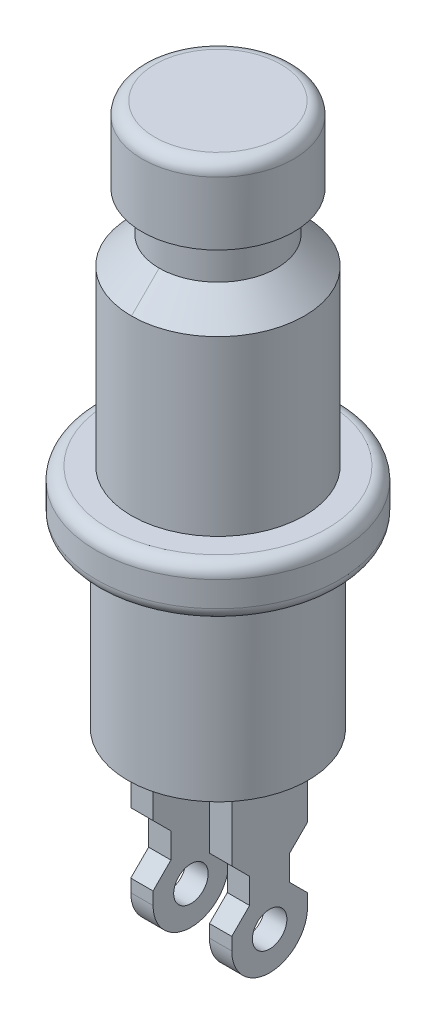
ISO-10303-21;
HEADER;
FILE_DESCRIPTION(('STEP AP214'),'2;1');
FILE_NAME('part.step','',(''),(''),'','','');
FILE_SCHEMA(('AUTOMOTIVE_DESIGN { 1 0 10303 214 1 1 1 1 }'));
ENDSEC;
DATA;
#1=APPLICATION_CONTEXT('core data for automotive mechanical design processes');
#2=APPLICATION_PROTOCOL_DEFINITION('international standard','automotive_design',2000,#1);
#3=PRODUCT_CONTEXT('',#1,'mechanical');
#4=PRODUCT('Part','Part','',(#3));
#5=PRODUCT_RELATED_PRODUCT_CATEGORY('part','',(#4));
#6=PRODUCT_DEFINITION_FORMATION('','',#4);
#7=PRODUCT_DEFINITION_CONTEXT('part definition',#1,'design');
#8=PRODUCT_DEFINITION('design','',#6,#7);
#9=PRODUCT_DEFINITION_SHAPE('','',#8);
#10=(LENGTH_UNIT() NAMED_UNIT(*) SI_UNIT(.MILLI.,.METRE.));
#11=(NAMED_UNIT(*) PLANE_ANGLE_UNIT() SI_UNIT($,.RADIAN.));
#12=(NAMED_UNIT(*) SI_UNIT($,.STERADIAN.) SOLID_ANGLE_UNIT());
#13=UNCERTAINTY_MEASURE_WITH_UNIT(LENGTH_MEASURE(1.E-05),#10,'distance_accuracy_value','');
#14=(GEOMETRIC_REPRESENTATION_CONTEXT(3) GLOBAL_UNCERTAINTY_ASSIGNED_CONTEXT((#13)) GLOBAL_UNIT_ASSIGNED_CONTEXT((#10,
#11,#12)) REPRESENTATION_CONTEXT('',''));
#15=CARTESIAN_POINT('',(0.,0.,0.));
#16=DIRECTION('',(0.,0.,1.));
#17=DIRECTION('',(1.,0.,0.));
#18=AXIS2_PLACEMENT_3D('',#15,#16,#17);
#19=CARTESIAN_POINT('',(2.,-12.,1.45298976478019));
#20=DIRECTION('',(0.,0.707106781186549,-0.707106781186546));
#21=DIRECTION('',(0.,0.707106781186546,0.707106781186549));
#22=AXIS2_PLACEMENT_3D('',#19,#20,#21);
#23=PLANE('',#22);
#24=DIRECTION('',(0.,0.707106781186546,0.707106781186549));
#25=VECTOR('',#24,1.);
#26=CARTESIAN_POINT('',(1.11686893527035,-12.,1.45298976478019));
#27=LINE('',#26,#25);
#28=CARTESIAN_POINT('',(1.11686893527035,-12.7071067811865,0.745882983593644));
#29=VERTEX_POINT('',#28);
#30=CARTESIAN_POINT('',(1.11686893527035,-12.,1.45298976478019));
#31=VERTEX_POINT('',#30);
#32=EDGE_CURVE('E602',#29,#31,#27,.T.);
#33=ORIENTED_EDGE('',*,*,#32,.F.);
#34=DIRECTION('',(-1.,0.,0.));
#35=VECTOR('',#34,1.);
#36=CARTESIAN_POINT('',(2.,-12.7071067811865,0.745882983593644));
#37=LINE('',#36,#35);
#38=CARTESIAN_POINT('',(2.,-12.7071067811865,0.745882983593644));
#39=VERTEX_POINT('',#38);
#40=EDGE_CURVE('E278',#39,#29,#37,.T.);
#41=ORIENTED_EDGE('',*,*,#40,.F.);
#42=DIRECTION('',(0.,-0.707106781186546,-0.707106781186549));
#43=VECTOR('',#42,1.);
#44=CARTESIAN_POINT('',(2.,-12.,1.45298976478019));
#45=LINE('',#44,#43);
#46=CARTESIAN_POINT('',(2.,-12.,1.45298976478019));
#47=VERTEX_POINT('',#46);
#48=EDGE_CURVE('E576',#47,#39,#45,.T.);
#49=ORIENTED_EDGE('',*,*,#48,.F.);
#50=DIRECTION('',(-1.,0.,0.));
#51=VECTOR('',#50,1.);
#52=CARTESIAN_POINT('',(2.,-12.,1.45298976478019));
#53=LINE('',#52,#51);
#54=EDGE_CURVE('E236',#47,#31,#53,.T.);
#55=ORIENTED_EDGE('',*,*,#54,.T.);
#56=EDGE_LOOP('',(#33,#41,#49,#55));
#57=FACE_BOUND('',#56,.T.);
#58=ADVANCED_FACE('F35',(#57),#23,.F.);
#59=DIRECTION('',(0.,-0.707106781186546,-0.707106781186549));
#60=VECTOR('',#59,1.);
#61=CARTESIAN_POINT('',(-1.11686893527035,-12.,1.45298976478019));
#62=LINE('',#61,#60);
#63=CARTESIAN_POINT('',(-1.11686893527035,-12.,1.45298976478019));
#64=VERTEX_POINT('',#63);
#65=CARTESIAN_POINT('',(-1.11686893527035,-12.7071067811865,0.745882983593644));
#66=VERTEX_POINT('',#65);
#67=EDGE_CURVE('E228',#64,#66,#62,.T.);
#68=ORIENTED_EDGE('',*,*,#67,.F.);
#69=CARTESIAN_POINT('',(-2.,-12.,1.45298976478019));
#70=VERTEX_POINT('',#69);
#71=EDGE_CURVE('E227',#64,#70,#53,.T.);
#72=ORIENTED_EDGE('',*,*,#71,.T.);
#73=DIRECTION('',(0.,-0.707106781186546,-0.707106781186549));
#74=VECTOR('',#73,1.);
#75=CARTESIAN_POINT('',(-2.,-12.,1.45298976478019));
#76=LINE('',#75,#74);
#77=CARTESIAN_POINT('',(-2.,-12.7071067811865,0.745882983593644));
#78=VERTEX_POINT('',#77);
#79=EDGE_CURVE('E544',#70,#78,#76,.T.);
#80=ORIENTED_EDGE('',*,*,#79,.T.);
#81=EDGE_CURVE('E277',#66,#78,#37,.T.);
#82=ORIENTED_EDGE('',*,*,#81,.F.);
#83=EDGE_LOOP('',(#68,#72,#80,#82));
#84=FACE_BOUND('',#83,.T.);
#85=ADVANCED_FACE('F359',(#84),#23,.F.);
#86=CARTESIAN_POINT('',(2.,-12.7071067811865,0.745882983593644));
#87=DIRECTION('',(0.,0.,-1.));
#88=DIRECTION('',(0.,1.,0.));
#89=AXIS2_PLACEMENT_3D('',#86,#87,#88);
#90=PLANE('',#89);
#91=DIRECTION('',(0.,1.,0.));
#92=VECTOR('',#91,1.);
#93=CARTESIAN_POINT('',(1.11686893527035,-12.7071067811865,0.745882983593644));
#94=LINE('',#93,#92);
#95=CARTESIAN_POINT('',(1.11686893527035,-13.7071067811865,0.745882983593646));
#96=VERTEX_POINT('',#95);
#97=EDGE_CURVE('E517',#96,#29,#94,.T.);
#98=ORIENTED_EDGE('',*,*,#97,.F.);
#99=DIRECTION('',(-1.,0.,0.));
#100=VECTOR('',#99,1.);
#101=CARTESIAN_POINT('',(2.,-13.7071067811865,0.745882983593646));
#102=LINE('',#101,#100);
#103=CARTESIAN_POINT('',(2.,-13.7071067811865,0.745882983593646));
#104=VERTEX_POINT('',#103);
#105=EDGE_CURVE('E274',#104,#96,#102,.T.);
#106=ORIENTED_EDGE('',*,*,#105,.F.);
#107=DIRECTION('',(0.,-1.,0.));
#108=VECTOR('',#107,1.);
#109=CARTESIAN_POINT('',(2.,-12.7071067811865,0.745882983593644));
#110=LINE('',#109,#108);
#111=EDGE_CURVE('E528',#39,#104,#110,.T.);
#112=ORIENTED_EDGE('',*,*,#111,.F.);
#113=ORIENTED_EDGE('',*,*,#40,.T.);
#114=EDGE_LOOP('',(#98,#106,#112,#113));
#115=FACE_BOUND('',#114,.T.);
#116=ADVANCED_FACE('F365',(#115),#90,.F.);
#117=DIRECTION('',(0.,-1.,0.));
#118=VECTOR('',#117,1.);
#119=CARTESIAN_POINT('',(-1.11686893527035,-12.7071067811865,0.745882983593644));
#120=LINE('',#119,#118);
#121=CARTESIAN_POINT('',(-1.11686893527035,-13.7071067811865,0.745882983593646));
#122=VERTEX_POINT('',#121);
#123=EDGE_CURVE('E621',#66,#122,#120,.T.);
#124=ORIENTED_EDGE('',*,*,#123,.F.);
#125=ORIENTED_EDGE('',*,*,#81,.T.);
#126=DIRECTION('',(0.,-1.,0.));
#127=VECTOR('',#126,1.);
#128=CARTESIAN_POINT('',(-2.,-12.7071067811865,0.745882983593644));
#129=LINE('',#128,#127);
#130=CARTESIAN_POINT('',(-2.,-13.7071067811865,0.745882983593646));
#131=VERTEX_POINT('',#130);
#132=EDGE_CURVE('E547',#78,#131,#129,.T.);
#133=ORIENTED_EDGE('',*,*,#132,.T.);
#134=EDGE_CURVE('E273',#122,#131,#102,.T.);
#135=ORIENTED_EDGE('',*,*,#134,.F.);
#136=EDGE_LOOP('',(#124,#125,#133,#135));
#137=FACE_BOUND('',#136,.T.);
#138=ADVANCED_FACE('F500',(#137),#90,.F.);
#139=CARTESIAN_POINT('',(2.,-13.7071067811865,0.745882983593646));
#140=DIRECTION('',(0.,-0.707106781186546,-0.707106781186549));
#141=DIRECTION('',(0.,0.707106781186549,-0.707106781186546));
#142=AXIS2_PLACEMENT_3D('',#139,#140,#141);
#143=PLANE('',#142);
#144=DIRECTION('',(0.,0.707106781186549,-0.707106781186546));
#145=VECTOR('',#144,1.);
#146=CARTESIAN_POINT('',(1.11686893527035,-13.7071067811865,0.745882983593646));
#147=LINE('',#146,#145);
#148=CARTESIAN_POINT('',(1.11686893527035,-14.4142135623731,1.45298976478019));
#149=VERTEX_POINT('',#148);
#150=EDGE_CURVE('E510',#149,#96,#147,.T.);
#151=ORIENTED_EDGE('',*,*,#150,.F.);
#152=DIRECTION('',(-1.,0.,0.));
#153=VECTOR('',#152,1.);
#154=CARTESIAN_POINT('',(2.,-14.4142135623731,1.45298976478019));
#155=LINE('',#154,#153);
#156=CARTESIAN_POINT('',(2.,-14.4142135623731,1.45298976478019));
#157=VERTEX_POINT('',#156);
#158=EDGE_CURVE('E270',#157,#149,#155,.T.);
#159=ORIENTED_EDGE('',*,*,#158,.F.);
#160=DIRECTION('',(0.,-0.707106781186549,0.707106781186546));
#161=VECTOR('',#160,1.);
#162=CARTESIAN_POINT('',(2.,-13.7071067811865,0.745882983593646));
#163=LINE('',#162,#161);
#164=EDGE_CURVE('E524',#104,#157,#163,.T.);
#165=ORIENTED_EDGE('',*,*,#164,.F.);
#166=ORIENTED_EDGE('',*,*,#105,.T.);
#167=EDGE_LOOP('',(#151,#159,#165,#166));
#168=FACE_BOUND('',#167,.T.);
#169=ADVANCED_FACE('F498',(#168),#143,.F.);
#170=DIRECTION('',(0.,-0.707106781186549,0.707106781186546));
#171=VECTOR('',#170,1.);
#172=CARTESIAN_POINT('',(-1.11686893527035,-13.7071067811865,0.745882983593646));
#173=LINE('',#172,#171);
#174=CARTESIAN_POINT('',(-1.11686893527035,-14.4142135623731,1.45298976478019));
#175=VERTEX_POINT('',#174);
#176=EDGE_CURVE('E619',#122,#175,#173,.T.);
#177=ORIENTED_EDGE('',*,*,#176,.F.);
#178=ORIENTED_EDGE('',*,*,#134,.T.);
#179=DIRECTION('',(0.,-0.707106781186549,0.707106781186546));
#180=VECTOR('',#179,1.);
#181=CARTESIAN_POINT('',(-2.,-13.7071067811865,0.745882983593646));
#182=LINE('',#181,#180);
#183=CARTESIAN_POINT('',(-2.,-14.4142135623731,1.45298976478019));
#184=VERTEX_POINT('',#183);
#185=EDGE_CURVE('E551',#131,#184,#182,.T.);
#186=ORIENTED_EDGE('',*,*,#185,.T.);
#187=EDGE_CURVE('E269',#175,#184,#155,.T.);
#188=ORIENTED_EDGE('',*,*,#187,.F.);
#189=EDGE_LOOP('',(#177,#178,#186,#188));
#190=FACE_BOUND('',#189,.T.);
#191=ADVANCED_FACE('F496',(#190),#143,.F.);
#192=CARTESIAN_POINT('',(2.,-14.4142135623731,1.45298976478019));
#193=DIRECTION('',(0.,0.,-1.));
#194=DIRECTION('',(0.,1.,0.));
#195=AXIS2_PLACEMENT_3D('',#192,#193,#194);
#196=PLANE('',#195);
#197=DIRECTION('',(0.,1.,0.));
#198=VECTOR('',#197,1.);
#199=CARTESIAN_POINT('',(1.11686893527035,-14.4142135623731,1.45298976478019));
#200=LINE('',#199,#198);
#201=CARTESIAN_POINT('',(1.11686893527035,-14.9142135623731,1.45298976478019));
#202=VERTEX_POINT('',#201);
#203=EDGE_CURVE('E516',#202,#149,#200,.T.);
#204=ORIENTED_EDGE('',*,*,#203,.F.);
#205=DIRECTION('',(-1.,0.,0.));
#206=VECTOR('',#205,1.);
#207=CARTESIAN_POINT('',(2.,-14.9142135623731,1.45298976478019));
#208=LINE('',#207,#206);
#209=CARTESIAN_POINT('',(2.,-14.9142135623731,1.45298976478019));
#210=VERTEX_POINT('',#209);
#211=EDGE_CURVE('E266',#210,#202,#208,.T.);
#212=ORIENTED_EDGE('',*,*,#211,.F.);
#213=DIRECTION('',(0.,-1.,0.));
#214=VECTOR('',#213,1.);
#215=CARTESIAN_POINT('',(2.,-14.4142135623731,1.45298976478019));
#216=LINE('',#215,#214);
#217=EDGE_CURVE('E521',#157,#210,#216,.T.);
#218=ORIENTED_EDGE('',*,*,#217,.F.);
#219=ORIENTED_EDGE('',*,*,#158,.T.);
#220=EDGE_LOOP('',(#204,#212,#218,#219));
#221=FACE_BOUND('',#220,.T.);
#222=ADVANCED_FACE('F494',(#221),#196,.F.);
#223=DIRECTION('',(0.,-1.,0.));
#224=VECTOR('',#223,1.);
#225=CARTESIAN_POINT('',(-1.11686893527035,-14.4142135623731,1.45298976478019));
#226=LINE('',#225,#224);
#227=CARTESIAN_POINT('',(-1.11686893527035,-14.9142135623731,1.45298976478019));
#228=VERTEX_POINT('',#227);
#229=EDGE_CURVE('E616',#175,#228,#226,.T.);
#230=ORIENTED_EDGE('',*,*,#229,.F.);
#231=ORIENTED_EDGE('',*,*,#187,.T.);
#232=DIRECTION('',(0.,-1.,0.));
#233=VECTOR('',#232,1.);
#234=CARTESIAN_POINT('',(-2.,-14.4142135623731,1.45298976478019));
#235=LINE('',#234,#233);
#236=CARTESIAN_POINT('',(-2.,-14.9142135623731,1.45298976478019));
#237=VERTEX_POINT('',#236);
#238=EDGE_CURVE('E554',#184,#237,#235,.T.);
#239=ORIENTED_EDGE('',*,*,#238,.T.);
#240=EDGE_CURVE('E265',#228,#237,#208,.T.);
#241=ORIENTED_EDGE('',*,*,#240,.F.);
#242=EDGE_LOOP('',(#230,#231,#239,#241));
#243=FACE_BOUND('',#242,.T.);
#244=ADVANCED_FACE('F492',(#243),#196,.F.);
#245=CARTESIAN_POINT('',(2.,-14.9142135623731,-0.0470102352198023));
#246=DIRECTION('',(-1.,0.,0.));
#247=DIRECTION('',(0.,0.,1.));
#248=AXIS2_PLACEMENT_3D('',#245,#246,#247);
#249=CYLINDRICAL_SURFACE('',#248,1.5);
#250=ORIENTED_EDGE('',*,*,#211,.T.);
#251=CARTESIAN_POINT('',(1.11686893527035,-14.9142135623731,-0.0470102352198023));
#252=DIRECTION('',(-1.,0.,0.));
#253=DIRECTION('',(0.,0.,1.));
#254=AXIS2_PLACEMENT_3D('',#251,#252,#253);
#255=CIRCLE('',#254,1.5);
#256=CARTESIAN_POINT('',(1.11686893527035,-14.9142135623731,-1.5470102352198));
#257=VERTEX_POINT('',#256);
#258=EDGE_CURVE('E598',#257,#202,#255,.T.);
#259=ORIENTED_EDGE('',*,*,#258,.F.);
#260=DIRECTION('',(-1.,0.,0.));
#261=VECTOR('',#260,1.);
#262=CARTESIAN_POINT('',(2.,-14.9142135623731,-1.5470102352198));
#263=LINE('',#262,#261);
#264=CARTESIAN_POINT('',(2.,-14.9142135623731,-1.5470102352198));
#265=VERTEX_POINT('',#264);
#266=EDGE_CURVE('E262',#265,#257,#263,.T.);
#267=ORIENTED_EDGE('',*,*,#266,.F.);
#268=CARTESIAN_POINT('',(2.,-14.9142135623731,-0.0470102352198023));
#269=DIRECTION('',(1.,0.,0.));
#270=DIRECTION('',(0.,0.,-1.));
#271=AXIS2_PLACEMENT_3D('',#268,#269,#270);
#272=CIRCLE('',#271,1.5);
#273=EDGE_CURVE('E523',#210,#265,#272,.T.);
#274=ORIENTED_EDGE('',*,*,#273,.F.);
#275=EDGE_LOOP('',(#250,#259,#267,#274));
#276=FACE_BOUND('',#275,.T.);
#277=ADVANCED_FACE('F489',(#276),#249,.T.);
#278=CARTESIAN_POINT('',(-1.11686893527035,-14.9142135623731,-0.0470102352198023));
#279=DIRECTION('',(1.,0.,0.));
#280=DIRECTION('',(0.,0.,-1.));
#281=AXIS2_PLACEMENT_3D('',#278,#279,#280);
#282=CIRCLE('',#281,1.5);
#283=CARTESIAN_POINT('',(-1.11686893527035,-14.9142135623731,-1.5470102352198));
#284=VERTEX_POINT('',#283);
#285=EDGE_CURVE('E614',#228,#284,#282,.T.);
#286=ORIENTED_EDGE('',*,*,#285,.F.);
#287=ORIENTED_EDGE('',*,*,#240,.T.);
#288=CARTESIAN_POINT('',(-2.,-14.9142135623731,-0.0470102352198023));
#289=DIRECTION('',(1.,0.,0.));
#290=DIRECTION('',(0.,0.,-1.));
#291=AXIS2_PLACEMENT_3D('',#288,#289,#290);
#292=CIRCLE('',#291,1.5);
#293=CARTESIAN_POINT('',(-2.,-14.9142135623731,-1.5470102352198));
#294=VERTEX_POINT('',#293);
#295=EDGE_CURVE('E557',#237,#294,#292,.T.);
#296=ORIENTED_EDGE('',*,*,#295,.T.);
#297=EDGE_CURVE('E261',#284,#294,#263,.T.);
#298=ORIENTED_EDGE('',*,*,#297,.F.);
#299=EDGE_LOOP('',(#286,#287,#296,#298));
#300=FACE_BOUND('',#299,.T.);
#301=ADVANCED_FACE('F487',(#300),#249,.T.);
#302=CARTESIAN_POINT('',(2.,-14.4142135623731,-1.54701023521981));
#303=DIRECTION('',(0.,0.,1.));
#304=DIRECTION('',(0.,-1.,0.));
#305=AXIS2_PLACEMENT_3D('',#302,#303,#304);
#306=PLANE('',#305);
#307=DIRECTION('',(0.,-1.,0.));
#308=VECTOR('',#307,1.);
#309=CARTESIAN_POINT('',(1.11686893527035,-14.4142135623731,-1.54701023521981));
#310=LINE('',#309,#308);
#311=CARTESIAN_POINT('',(1.11686893527035,-14.4142135623731,-1.54701023521981));
#312=VERTEX_POINT('',#311);
#313=EDGE_CURVE('E596',#312,#257,#310,.T.);
#314=ORIENTED_EDGE('',*,*,#313,.F.);
#315=DIRECTION('',(-1.,0.,0.));
#316=VECTOR('',#315,1.);
#317=CARTESIAN_POINT('',(2.,-14.4142135623731,-1.54701023521981));
#318=LINE('',#317,#316);
#319=CARTESIAN_POINT('',(2.,-14.4142135623731,-1.54701023521981));
#320=VERTEX_POINT('',#319);
#321=EDGE_CURVE('E258',#320,#312,#318,.T.);
#322=ORIENTED_EDGE('',*,*,#321,.F.);
#323=DIRECTION('',(0.,1.,0.));
#324=VECTOR('',#323,1.);
#325=CARTESIAN_POINT('',(2.,-14.4142135623731,-1.54701023521981));
#326=LINE('',#325,#324);
#327=EDGE_CURVE('E526',#265,#320,#326,.T.);
#328=ORIENTED_EDGE('',*,*,#327,.F.);
#329=ORIENTED_EDGE('',*,*,#266,.T.);
#330=EDGE_LOOP('',(#314,#322,#328,#329));
#331=FACE_BOUND('',#330,.T.);
#332=ADVANCED_FACE('F484',(#331),#306,.F.);
#333=DIRECTION('',(0.,1.,0.));
#334=VECTOR('',#333,1.);
#335=CARTESIAN_POINT('',(-1.11686893527035,-14.4142135623731,-1.54701023521981));
#336=LINE('',#335,#334);
#337=CARTESIAN_POINT('',(-1.11686893527035,-14.4142135623731,-1.54701023521981));
#338=VERTEX_POINT('',#337);
#339=EDGE_CURVE('E612',#284,#338,#336,.T.);
#340=ORIENTED_EDGE('',*,*,#339,.F.);
#341=ORIENTED_EDGE('',*,*,#297,.T.);
#342=DIRECTION('',(0.,1.,0.));
#343=VECTOR('',#342,1.);
#344=CARTESIAN_POINT('',(-2.,-14.4142135623731,-1.54701023521981));
#345=LINE('',#344,#343);
#346=CARTESIAN_POINT('',(-2.,-14.4142135623731,-1.54701023521981));
#347=VERTEX_POINT('',#346);
#348=EDGE_CURVE('E560',#294,#347,#345,.T.);
#349=ORIENTED_EDGE('',*,*,#348,.T.);
#350=EDGE_CURVE('E257',#338,#347,#318,.T.);
#351=ORIENTED_EDGE('',*,*,#350,.F.);
#352=EDGE_LOOP('',(#340,#341,#349,#351));
#353=FACE_BOUND('',#352,.T.);
#354=ADVANCED_FACE('F482',(#353),#306,.F.);
#355=CARTESIAN_POINT('',(2.,-13.7071067811865,-0.839903454033259));
#356=DIRECTION('',(0.,-0.707106781186556,0.707106781186539));
#357=DIRECTION('',(0.,-0.707106781186539,-0.707106781186556));
#358=AXIS2_PLACEMENT_3D('',#355,#356,#357);
#359=PLANE('',#358);
#360=DIRECTION('',(0.,-0.707106781186539,-0.707106781186556));
#361=VECTOR('',#360,1.);
#362=CARTESIAN_POINT('',(1.11686893527035,-13.7071067811865,-0.839903454033259));
#363=LINE('',#362,#361);
#364=CARTESIAN_POINT('',(1.11686893527035,-13.7071067811865,-0.839903454033259));
#365=VERTEX_POINT('',#364);
#366=EDGE_CURVE('E594',#365,#312,#363,.T.);
#367=ORIENTED_EDGE('',*,*,#366,.F.);
#368=DIRECTION('',(-1.,0.,0.));
#369=VECTOR('',#368,1.);
#370=CARTESIAN_POINT('',(2.,-13.7071067811865,-0.839903454033259));
#371=LINE('',#370,#369);
#372=CARTESIAN_POINT('',(2.,-13.7071067811865,-0.839903454033259));
#373=VERTEX_POINT('',#372);
#374=EDGE_CURVE('E254',#373,#365,#371,.T.);
#375=ORIENTED_EDGE('',*,*,#374,.F.);
#376=DIRECTION('',(0.,0.707106781186539,0.707106781186556));
#377=VECTOR('',#376,1.);
#378=CARTESIAN_POINT('',(2.,-13.7071067811865,-0.839903454033259));
#379=LINE('',#378,#377);
#380=EDGE_CURVE('E533',#320,#373,#379,.T.);
#381=ORIENTED_EDGE('',*,*,#380,.F.);
#382=ORIENTED_EDGE('',*,*,#321,.T.);
#383=EDGE_LOOP('',(#367,#375,#381,#382));
#384=FACE_BOUND('',#383,.T.);
#385=ADVANCED_FACE('F479',(#384),#359,.F.);
#386=DIRECTION('',(0.,0.707106781186539,0.707106781186556));
#387=VECTOR('',#386,1.);
#388=CARTESIAN_POINT('',(-1.11686893527035,-13.7071067811865,-0.839903454033259));
#389=LINE('',#388,#387);
#390=CARTESIAN_POINT('',(-1.11686893527035,-13.7071067811865,-0.839903454033259));
#391=VERTEX_POINT('',#390);
#392=EDGE_CURVE('E610',#338,#391,#389,.T.);
#393=ORIENTED_EDGE('',*,*,#392,.F.);
#394=ORIENTED_EDGE('',*,*,#350,.T.);
#395=DIRECTION('',(0.,0.707106781186539,0.707106781186556));
#396=VECTOR('',#395,1.);
#397=CARTESIAN_POINT('',(-2.,-13.7071067811865,-0.839903454033259));
#398=LINE('',#397,#396);
#399=CARTESIAN_POINT('',(-2.,-13.7071067811865,-0.839903454033259));
#400=VERTEX_POINT('',#399);
#401=EDGE_CURVE('E563',#347,#400,#398,.T.);
#402=ORIENTED_EDGE('',*,*,#401,.T.);
#403=EDGE_CURVE('E253',#391,#400,#371,.T.);
#404=ORIENTED_EDGE('',*,*,#403,.F.);
#405=EDGE_LOOP('',(#393,#394,#402,#404));
#406=FACE_BOUND('',#405,.T.);
#407=ADVANCED_FACE('F477',(#406),#359,.F.);
#408=CARTESIAN_POINT('',(2.,-12.7071067811865,-0.839903454033261));
#409=DIRECTION('',(0.,0.,1.));
#410=DIRECTION('',(0.,-1.,0.));
#411=AXIS2_PLACEMENT_3D('',#408,#409,#410);
#412=PLANE('',#411);
#413=DIRECTION('',(0.,-1.,0.));
#414=VECTOR('',#413,1.);
#415=CARTESIAN_POINT('',(1.11686893527035,-12.7071067811865,-0.839903454033261));
#416=LINE('',#415,#414);
#417=CARTESIAN_POINT('',(1.11686893527035,-12.7071067811865,-0.839903454033261));
#418=VERTEX_POINT('',#417);
#419=EDGE_CURVE('E592',#418,#365,#416,.T.);
#420=ORIENTED_EDGE('',*,*,#419,.F.);
#421=DIRECTION('',(-1.,0.,0.));
#422=VECTOR('',#421,1.);
#423=CARTESIAN_POINT('',(2.,-12.7071067811865,-0.839903454033261));
#424=LINE('',#423,#422);
#425=CARTESIAN_POINT('',(2.,-12.7071067811865,-0.839903454033261));
#426=VERTEX_POINT('',#425);
#427=EDGE_CURVE('E250',#426,#418,#424,.T.);
#428=ORIENTED_EDGE('',*,*,#427,.F.);
#429=DIRECTION('',(0.,1.,0.));
#430=VECTOR('',#429,1.);
#431=CARTESIAN_POINT('',(2.,-12.7071067811865,-0.839903454033261));
#432=LINE('',#431,#430);
#433=EDGE_CURVE('E535',#373,#426,#432,.T.);
#434=ORIENTED_EDGE('',*,*,#433,.F.);
#435=ORIENTED_EDGE('',*,*,#374,.T.);
#436=EDGE_LOOP('',(#420,#428,#434,#435));
#437=FACE_BOUND('',#436,.T.);
#438=ADVANCED_FACE('F474',(#437),#412,.F.);
#439=DIRECTION('',(0.,1.,0.));
#440=VECTOR('',#439,1.);
#441=CARTESIAN_POINT('',(-1.11686893527035,-12.7071067811865,-0.839903454033261));
#442=LINE('',#441,#440);
#443=CARTESIAN_POINT('',(-1.11686893527035,-12.7071067811865,-0.839903454033261));
#444=VERTEX_POINT('',#443);
#445=EDGE_CURVE('E608',#391,#444,#442,.T.);
#446=ORIENTED_EDGE('',*,*,#445,.F.);
#447=ORIENTED_EDGE('',*,*,#403,.T.);
#448=DIRECTION('',(0.,1.,0.));
#449=VECTOR('',#448,1.);
#450=CARTESIAN_POINT('',(-2.,-12.7071067811865,-0.839903454033261));
#451=LINE('',#450,#449);
#452=CARTESIAN_POINT('',(-2.,-12.7071067811865,-0.839903454033261));
#453=VERTEX_POINT('',#452);
#454=EDGE_CURVE('E566',#400,#453,#451,.T.);
#455=ORIENTED_EDGE('',*,*,#454,.T.);
#456=EDGE_CURVE('E249',#444,#453,#424,.T.);
#457=ORIENTED_EDGE('',*,*,#456,.F.);
#458=EDGE_LOOP('',(#446,#447,#455,#457));
#459=FACE_BOUND('',#458,.T.);
#460=ADVANCED_FACE('F472',(#459),#412,.F.);
#461=CARTESIAN_POINT('',(2.,-12.,-1.54701023521981));
#462=DIRECTION('',(0.,0.707106781186547,0.707106781186548));
#463=DIRECTION('',(0.,-0.707106781186548,0.707106781186547));
#464=AXIS2_PLACEMENT_3D('',#461,#462,#463);
#465=PLANE('',#464);
#466=DIRECTION('',(0.,-0.707106781186548,0.707106781186547));
#467=VECTOR('',#466,1.);
#468=CARTESIAN_POINT('',(1.11686893527035,-12.,-1.54701023521981));
#469=LINE('',#468,#467);
#470=CARTESIAN_POINT('',(1.11686893527035,-12.,-1.54701023521981));
#471=VERTEX_POINT('',#470);
#472=EDGE_CURVE('E590',#471,#418,#469,.T.);
#473=ORIENTED_EDGE('',*,*,#472,.F.);
#474=DIRECTION('',(-1.,0.,0.));
#475=VECTOR('',#474,1.);
#476=CARTESIAN_POINT('',(2.,-12.,-1.54701023521981));
#477=LINE('',#476,#475);
#478=CARTESIAN_POINT('',(2.,-12.,-1.54701023521981));
#479=VERTEX_POINT('',#478);
#480=EDGE_CURVE('E246',#479,#471,#477,.T.);
#481=ORIENTED_EDGE('',*,*,#480,.F.);
#482=DIRECTION('',(0.,0.707106781186548,-0.707106781186547));
#483=VECTOR('',#482,1.);
#484=CARTESIAN_POINT('',(2.,-12.,-1.54701023521981));
#485=LINE('',#484,#483);
#486=EDGE_CURVE('E537',#426,#479,#485,.T.);
#487=ORIENTED_EDGE('',*,*,#486,.F.);
#488=ORIENTED_EDGE('',*,*,#427,.T.);
#489=EDGE_LOOP('',(#473,#481,#487,#488));
#490=FACE_BOUND('',#489,.T.);
#491=ADVANCED_FACE('F469',(#490),#465,.F.);
#492=DIRECTION('',(0.,0.707106781186548,-0.707106781186547));
#493=VECTOR('',#492,1.);
#494=CARTESIAN_POINT('',(-1.11686893527035,-12.,-1.54701023521981));
#495=LINE('',#494,#493);
#496=CARTESIAN_POINT('',(-1.11686893527035,-12.,-1.54701023521981));
#497=VERTEX_POINT('',#496);
#498=EDGE_CURVE('E606',#444,#497,#495,.T.);
#499=ORIENTED_EDGE('',*,*,#498,.F.);
#500=ORIENTED_EDGE('',*,*,#456,.T.);
#501=DIRECTION('',(0.,0.707106781186548,-0.707106781186547));
#502=VECTOR('',#501,1.);
#503=CARTESIAN_POINT('',(-2.,-12.,-1.54701023521981));
#504=LINE('',#503,#502);
#505=CARTESIAN_POINT('',(-2.,-12.,-1.54701023521981));
#506=VERTEX_POINT('',#505);
#507=EDGE_CURVE('E569',#453,#506,#504,.T.);
#508=ORIENTED_EDGE('',*,*,#507,.T.);
#509=EDGE_CURVE('E245',#497,#506,#477,.T.);
#510=ORIENTED_EDGE('',*,*,#509,.F.);
#511=EDGE_LOOP('',(#499,#500,#508,#510));
#512=FACE_BOUND('',#511,.T.);
#513=ADVANCED_FACE('F467',(#512),#465,.F.);
#514=CARTESIAN_POINT('',(2.,-9.,-1.54701023521981));
#515=DIRECTION('',(0.,0.,1.));
#516=DIRECTION('',(0.,-1.,0.));
#517=AXIS2_PLACEMENT_3D('',#514,#515,#516);
#518=PLANE('',#517);
#519=DIRECTION('',(0.,-1.,0.));
#520=VECTOR('',#519,1.);
#521=CARTESIAN_POINT('',(1.11686893527035,-9.,-1.54701023521981));
#522=LINE('',#521,#520);
#523=CARTESIAN_POINT('',(1.11686893527035,-9.,-1.54701023521981));
#524=VERTEX_POINT('',#523);
#525=EDGE_CURVE('E586',#524,#471,#522,.T.);
#526=ORIENTED_EDGE('',*,*,#525,.F.);
#527=DIRECTION('',(-1.,0.,0.));
#528=VECTOR('',#527,1.);
#529=CARTESIAN_POINT('',(2.,-9.,-1.54701023521981));
#530=LINE('',#529,#528);
#531=CARTESIAN_POINT('',(2.,-9.,-1.54701023521981));
#532=VERTEX_POINT('',#531);
#533=EDGE_CURVE('E243',#532,#524,#530,.T.);
#534=ORIENTED_EDGE('',*,*,#533,.F.);
#535=DIRECTION('',(0.,1.,0.));
#536=VECTOR('',#535,1.);
#537=CARTESIAN_POINT('',(2.,-9.,-1.54701023521981));
#538=LINE('',#537,#536);
#539=EDGE_CURVE('E539',#479,#532,#538,.T.);
#540=ORIENTED_EDGE('',*,*,#539,.F.);
#541=ORIENTED_EDGE('',*,*,#480,.T.);
#542=EDGE_LOOP('',(#526,#534,#540,#541));
#543=FACE_BOUND('',#542,.T.);
#544=ADVANCED_FACE('F464',(#543),#518,.F.);
#545=DIRECTION('',(0.,1.,0.));
#546=VECTOR('',#545,1.);
#547=CARTESIAN_POINT('',(-1.11686893527035,-9.,-1.54701023521981));
#548=LINE('',#547,#546);
#549=CARTESIAN_POINT('',(-1.11686893527035,-9.,-1.54701023521981));
#550=VERTEX_POINT('',#549);
#551=EDGE_CURVE('E215',#497,#550,#548,.T.);
#552=ORIENTED_EDGE('',*,*,#551,.F.);
#553=ORIENTED_EDGE('',*,*,#509,.T.);
#554=DIRECTION('',(0.,1.,0.));
#555=VECTOR('',#554,1.);
#556=CARTESIAN_POINT('',(-2.,-9.,-1.54701023521981));
#557=LINE('',#556,#555);
#558=CARTESIAN_POINT('',(-2.,-9.,-1.54701023521981));
#559=VERTEX_POINT('',#558);
#560=EDGE_CURVE('E572',#506,#559,#557,.T.);
#561=ORIENTED_EDGE('',*,*,#560,.T.);
#562=EDGE_CURVE('E238',#550,#559,#530,.T.);
#563=ORIENTED_EDGE('',*,*,#562,.F.);
#564=EDGE_LOOP('',(#552,#553,#561,#563));
#565=FACE_BOUND('',#564,.T.);
#566=ADVANCED_FACE('F463',(#565),#518,.F.);
#567=CARTESIAN_POINT('',(2.,-9.,1.45298976478019));
#568=DIRECTION('',(0.,0.,-1.));
#569=DIRECTION('',(0.,1.,0.));
#570=AXIS2_PLACEMENT_3D('',#567,#568,#569);
#571=PLANE('',#570);
#572=DIRECTION('',(0.,1.,0.));
#573=VECTOR('',#572,1.);
#574=CARTESIAN_POINT('',(1.11686893527035,-9.,1.45298976478019));
#575=LINE('',#574,#573);
#576=CARTESIAN_POINT('',(1.11686893527035,-9.,1.45298976478019));
#577=VERTEX_POINT('',#576);
#578=EDGE_CURVE('E333',#31,#577,#575,.T.);
#579=ORIENTED_EDGE('',*,*,#578,.F.);
#580=ORIENTED_EDGE('',*,*,#54,.F.);
#581=DIRECTION('',(0.,-1.,0.));
#582=VECTOR('',#581,1.);
#583=CARTESIAN_POINT('',(2.,-9.,1.45298976478019));
#584=LINE('',#583,#582);
#585=CARTESIAN_POINT('',(2.,-9.,1.45298976478019));
#586=VERTEX_POINT('',#585);
#587=EDGE_CURVE('E58',#586,#47,#584,.T.);
#588=ORIENTED_EDGE('',*,*,#587,.F.);
#589=DIRECTION('',(-1.,0.,0.));
#590=VECTOR('',#589,1.);
#591=CARTESIAN_POINT('',(2.,-9.,1.45298976478019));
#592=LINE('',#591,#590);
#593=EDGE_CURVE('E235',#586,#577,#592,.T.);
#594=ORIENTED_EDGE('',*,*,#593,.T.);
#595=EDGE_LOOP('',(#579,#580,#588,#594));
#596=FACE_BOUND('',#595,.T.);
#597=ADVANCED_FACE('F460',(#596),#571,.F.);
#598=DIRECTION('',(0.,-1.,0.));
#599=VECTOR('',#598,1.);
#600=CARTESIAN_POINT('',(-1.11686893527035,-9.,1.45298976478019));
#601=LINE('',#600,#599);
#602=CARTESIAN_POINT('',(-1.11686893527035,-9.,1.45298976478019));
#603=VERTEX_POINT('',#602);
#604=EDGE_CURVE('E212',#603,#64,#601,.T.);
#605=ORIENTED_EDGE('',*,*,#604,.F.);
#606=CARTESIAN_POINT('',(-2.,-9.,1.45298976478019));
#607=VERTEX_POINT('',#606);
#608=EDGE_CURVE('E225',#603,#607,#592,.T.);
#609=ORIENTED_EDGE('',*,*,#608,.T.);
#610=DIRECTION('',(0.,-1.,0.));
#611=VECTOR('',#610,1.);
#612=CARTESIAN_POINT('',(-2.,-9.,1.45298976478019));
#613=LINE('',#612,#611);
#614=EDGE_CURVE('E575',#607,#70,#613,.T.);
#615=ORIENTED_EDGE('',*,*,#614,.T.);
#616=ORIENTED_EDGE('',*,*,#71,.F.);
#617=EDGE_LOOP('',(#605,#609,#615,#616));
#618=FACE_BOUND('',#617,.T.);
#619=ADVANCED_FACE('F223',(#618),#571,.F.);
#620=CARTESIAN_POINT('',(2.,-14.9142135623731,-0.0470102352198023));
#621=DIRECTION('',(-1.,0.,0.));
#622=DIRECTION('',(0.,0.,1.));
#623=AXIS2_PLACEMENT_3D('',#620,#621,#622);
#624=CYLINDRICAL_SURFACE('',#623,0.683030705880567);
#625=CARTESIAN_POINT('',(2.,-14.9142135623731,-0.0470102352198023));
#626=DIRECTION('',(1.,0.,0.));
#627=DIRECTION('',(0.,0.,-1.));
#628=AXIS2_PLACEMENT_3D('',#625,#626,#627);
#629=CIRCLE('',#628,0.683030705880567);
#630=CARTESIAN_POINT('',(2.,-14.9142135623731,-0.730040941100369));
#631=VERTEX_POINT('',#630);
#632=EDGE_CURVE('E548',#631,#631,#629,.T.);
#633=ORIENTED_EDGE('',*,*,#632,.T.);
#634=EDGE_LOOP('',(#633));
#635=FACE_BOUND('',#634,.T.);
#636=CARTESIAN_POINT('',(1.11686893527035,-14.9142135623731,-0.0470102352198023));
#637=DIRECTION('',(-1.,0.,0.));
#638=DIRECTION('',(0.,0.,1.));
#639=AXIS2_PLACEMENT_3D('',#636,#637,#638);
#640=CIRCLE('',#639,0.683030705880567);
#641=CARTESIAN_POINT('',(1.11686893527035,-14.9142135623731,0.636020470660764));
#642=VERTEX_POINT('',#641);
#643=EDGE_CURVE('E330',#642,#642,#640,.T.);
#644=ORIENTED_EDGE('',*,*,#643,.T.);
#645=EDGE_LOOP('',(#644));
#646=FACE_BOUND('',#645,.T.);
#647=ADVANCED_FACE('F450',(#635,#646),#624,.F.);
#648=CARTESIAN_POINT('',(-2.,-14.9142135623731,-0.0470102352198023));
#649=DIRECTION('',(1.,0.,0.));
#650=DIRECTION('',(0.,0.,-1.));
#651=AXIS2_PLACEMENT_3D('',#648,#649,#650);
#652=CIRCLE('',#651,0.683030705880567);
#653=CARTESIAN_POINT('',(-2.,-14.9142135623731,-0.730040941100369));
#654=VERTEX_POINT('',#653);
#655=EDGE_CURVE('E583',#654,#654,#652,.T.);
#656=ORIENTED_EDGE('',*,*,#655,.F.);
#657=EDGE_LOOP('',(#656));
#658=FACE_BOUND('',#657,.T.);
#659=CARTESIAN_POINT('',(-1.11686893527035,-14.9142135623731,-0.0470102352198023));
#660=DIRECTION('',(1.,0.,0.));
#661=DIRECTION('',(0.,0.,-1.));
#662=AXIS2_PLACEMENT_3D('',#659,#660,#661);
#663=CIRCLE('',#662,0.683030705880567);
#664=CARTESIAN_POINT('',(-1.11686893527035,-14.9142135623731,-0.730040941100369));
#665=VERTEX_POINT('',#664);
#666=EDGE_CURVE('E219',#665,#665,#663,.T.);
#667=ORIENTED_EDGE('',*,*,#666,.T.);
#668=EDGE_LOOP('',(#667));
#669=FACE_BOUND('',#668,.T.);
#670=ADVANCED_FACE('F410',(#658,#669),#624,.F.);
#671=CARTESIAN_POINT('',(0.,-9.,0.));
#672=DIRECTION('',(0.,-1.,0.));
#673=DIRECTION('',(0.,0.,-1.));
#674=AXIS2_PLACEMENT_3D('',#671,#672,#673);
#675=PLANE('',#674);
#676=DIRECTION('',(0.,0.,1.));
#677=VECTOR('',#676,1.);
#678=CARTESIAN_POINT('',(1.11686893527035,-9.,-3.39606077410698));
#679=LINE('',#678,#677);
#680=EDGE_CURVE('E50',#524,#577,#679,.T.);
#681=ORIENTED_EDGE('',*,*,#680,.T.);
#682=ORIENTED_EDGE('',*,*,#593,.F.);
#683=DIRECTION('',(0.,0.,1.));
#684=VECTOR('',#683,1.);
#685=CARTESIAN_POINT('',(2.,-9.,1.45298976478019));
#686=LINE('',#685,#684);
#687=EDGE_CURVE('E541',#532,#586,#686,.T.);
#688=ORIENTED_EDGE('',*,*,#687,.F.);
#689=ORIENTED_EDGE('',*,*,#533,.T.);
#690=EDGE_LOOP('',(#681,#682,#688,#689));
#691=FACE_BOUND('',#690,.T.);
#692=DIRECTION('',(0.,0.,-1.));
#693=VECTOR('',#692,1.);
#694=CARTESIAN_POINT('',(-1.11686893527035,-9.,-3.39606077410698));
#695=LINE('',#694,#693);
#696=EDGE_CURVE('E209',#603,#550,#695,.T.);
#697=ORIENTED_EDGE('',*,*,#696,.T.);
#698=ORIENTED_EDGE('',*,*,#562,.T.);
#699=DIRECTION('',(0.,0.,1.));
#700=VECTOR('',#699,1.);
#701=CARTESIAN_POINT('',(-2.,-9.,1.45298976478019));
#702=LINE('',#701,#700);
#703=EDGE_CURVE('E234',#559,#607,#702,.T.);
#704=ORIENTED_EDGE('',*,*,#703,.T.);
#705=ORIENTED_EDGE('',*,*,#608,.F.);
#706=EDGE_LOOP('',(#697,#698,#704,#705));
#707=FACE_BOUND('',#706,.T.);
#708=CARTESIAN_POINT('',(0.,-9.,0.));
#709=DIRECTION('',(0.,-1.,0.));
#710=DIRECTION('',(0.,0.,-1.));
#711=AXIS2_PLACEMENT_3D('',#708,#709,#710);
#712=CIRCLE('',#711,3.575);
#713=CARTESIAN_POINT('',(0.,-9.,-3.575));
#714=VERTEX_POINT('',#713);
#715=EDGE_CURVE('E306',#714,#714,#712,.T.);
#716=ORIENTED_EDGE('',*,*,#715,.T.);
#717=EDGE_LOOP('',(#716));
#718=FACE_BOUND('',#717,.T.);
#719=ADVANCED_FACE('F231',(#691,#707,#718),#675,.T.);
#720=CARTESIAN_POINT('',(0.,11.85,0.));
#721=DIRECTION('',(0.,1.,0.));
#722=DIRECTION('',(0.,0.,1.));
#723=AXIS2_PLACEMENT_3D('',#720,#721,#722);
#724=PLANE('',#723);
#725=CARTESIAN_POINT('',(0.,11.85,0.));
#726=DIRECTION('',(0.,1.,0.));
#727=DIRECTION('',(0.,0.,1.));
#728=AXIS2_PLACEMENT_3D('',#725,#726,#727);
#729=CIRCLE('',#728,2.33);
#730=CARTESIAN_POINT('',(0.,11.85,2.33));
#731=VERTEX_POINT('',#730);
#732=EDGE_CURVE('E299',#731,#731,#729,.T.);
#733=ORIENTED_EDGE('',*,*,#732,.T.);
#734=EDGE_LOOP('',(#733));
#735=FACE_BOUND('',#734,.T.);
#736=CARTESIAN_POINT('',(0.,11.85,0.));
#737=DIRECTION('',(0.,-1.,0.));
#738=DIRECTION('',(0.,0.,-1.));
#739=AXIS2_PLACEMENT_3D('',#736,#737,#738);
#740=CIRCLE('',#739,2.4443878368772);
#741=CARTESIAN_POINT('',(0.,11.85,-2.4443878368772));
#742=VERTEX_POINT('',#741);
#743=EDGE_CURVE('E281',#742,#742,#740,.T.);
#744=ORIENTED_EDGE('',*,*,#743,.T.);
#745=EDGE_LOOP('',(#744));
#746=FACE_BOUND('',#745,.T.);
#747=ADVANCED_FACE('F383',(#735,#746),#724,.F.);
#748=CARTESIAN_POINT('',(0.,-2.,0.));
#749=DIRECTION('',(0.,1.,0.));
#750=DIRECTION('',(0.,0.,1.));
#751=AXIS2_PLACEMENT_3D('',#748,#749,#750);
#752=CYLINDRICAL_SURFACE('',#751,4.815);
#753=CARTESIAN_POINT('',(0.,-0.5,0.));
#754=DIRECTION('',(0.,1.,0.));
#755=DIRECTION('',(0.,0.,1.));
#756=AXIS2_PLACEMENT_3D('',#753,#754,#755);
#757=CIRCLE('',#756,4.815);
#758=CARTESIAN_POINT('',(0.,-0.5,4.815));
#759=VERTEX_POINT('',#758);
#760=EDGE_CURVE('E339',#759,#759,#757,.F.);
#761=ORIENTED_EDGE('',*,*,#760,.T.);
#762=EDGE_LOOP('',(#761));
#763=FACE_BOUND('',#762,.T.);
#764=CARTESIAN_POINT('',(0.,-1.5,0.));
#765=DIRECTION('',(0.,1.,0.));
#766=DIRECTION('',(0.,0.,1.));
#767=AXIS2_PLACEMENT_3D('',#764,#765,#766);
#768=CIRCLE('',#767,4.815);
#769=CARTESIAN_POINT('',(0.,-1.5,4.815));
#770=VERTEX_POINT('',#769);
#771=EDGE_CURVE('E336',#770,#770,#768,.T.);
#772=ORIENTED_EDGE('',*,*,#771,.T.);
#773=EDGE_LOOP('',(#772));
#774=FACE_BOUND('',#773,.T.);
#775=ADVANCED_FACE('F386',(#763,#774),#752,.T.);
#776=CARTESIAN_POINT('',(0.,-2.,0.));
#777=DIRECTION('',(0.,1.,0.));
#778=DIRECTION('',(0.,0.,1.));
#779=AXIS2_PLACEMENT_3D('',#776,#777,#778);
#780=PLANE('',#779);
#781=CARTESIAN_POINT('',(0.,-2.,0.));
#782=DIRECTION('',(0.,1.,0.));
#783=DIRECTION('',(0.,0.,1.));
#784=AXIS2_PLACEMENT_3D('',#781,#782,#783);
#785=CIRCLE('',#784,4.315);
#786=CARTESIAN_POINT('',(0.,-2.,4.315));
#787=VERTEX_POINT('',#786);
#788=EDGE_CURVE('E342',#787,#787,#785,.F.);
#789=ORIENTED_EDGE('',*,*,#788,.T.);
#790=EDGE_LOOP('',(#789));
#791=FACE_BOUND('',#790,.T.);
#792=CARTESIAN_POINT('',(0.,-2.,0.));
#793=DIRECTION('',(0.,1.,0.));
#794=DIRECTION('',(0.,0.,1.));
#795=AXIS2_PLACEMENT_3D('',#792,#793,#794);
#796=CIRCLE('',#795,3.575);
#797=CARTESIAN_POINT('',(0.,-2.,3.575));
#798=VERTEX_POINT('',#797);
#799=EDGE_CURVE('E309',#798,#798,#796,.F.);
#800=ORIENTED_EDGE('',*,*,#799,.F.);
#801=EDGE_LOOP('',(#800));
#802=FACE_BOUND('',#801,.T.);
#803=ADVANCED_FACE('F415',(#791,#802),#780,.F.);
#804=CARTESIAN_POINT('',(0.,0.,0.));
#805=DIRECTION('',(0.,1.,0.));
#806=DIRECTION('',(0.,0.,1.));
#807=AXIS2_PLACEMENT_3D('',#804,#805,#806);
#808=PLANE('',#807);
#809=CARTESIAN_POINT('',(0.,0.,0.));
#810=DIRECTION('',(0.,1.,0.));
#811=DIRECTION('',(0.,0.,1.));
#812=AXIS2_PLACEMENT_3D('',#809,#810,#811);
#813=CIRCLE('',#812,4.315);
#814=CARTESIAN_POINT('',(0.,0.,4.315));
#815=VERTEX_POINT('',#814);
#816=EDGE_CURVE('E312',#815,#815,#813,.T.);
#817=ORIENTED_EDGE('',*,*,#816,.T.);
#818=EDGE_LOOP('',(#817));
#819=FACE_BOUND('',#818,.T.);
#820=CARTESIAN_POINT('',(0.,0.,0.));
#821=DIRECTION('',(0.,1.,0.));
#822=DIRECTION('',(0.,0.,1.));
#823=AXIS2_PLACEMENT_3D('',#820,#821,#822);
#824=CIRCLE('',#823,3.425);
#825=CARTESIAN_POINT('',(0.,0.,3.425));
#826=VERTEX_POINT('',#825);
#827=EDGE_CURVE('E302',#826,#826,#824,.T.);
#828=ORIENTED_EDGE('',*,*,#827,.F.);
#829=EDGE_LOOP('',(#828));
#830=FACE_BOUND('',#829,.T.);
#831=ADVANCED_FACE('F413',(#819,#830),#808,.T.);
#832=CARTESIAN_POINT('',(0.,-9.,0.));
#833=DIRECTION('',(0.,1.,0.));
#834=DIRECTION('',(0.,0.,1.));
#835=AXIS2_PLACEMENT_3D('',#832,#833,#834);
#836=CYLINDRICAL_SURFACE('',#835,3.575);
#837=ORIENTED_EDGE('',*,*,#715,.F.);
#838=EDGE_LOOP('',(#837));
#839=FACE_BOUND('',#838,.T.);
#840=ORIENTED_EDGE('',*,*,#799,.T.);
#841=EDGE_LOOP('',(#840));
#842=FACE_BOUND('',#841,.T.);
#843=ADVANCED_FACE('F406',(#839,#842),#836,.T.);
#844=CARTESIAN_POINT('',(0.,6.85,0.));
#845=DIRECTION('',(0.,-1.,0.));
#846=DIRECTION('',(0.,0.,-1.));
#847=AXIS2_PLACEMENT_3D('',#844,#845,#846);
#848=CYLINDRICAL_SURFACE('',#847,3.425);
#849=CARTESIAN_POINT('',(0.,6.85,0.));
#850=DIRECTION('',(0.,1.,0.));
#851=DIRECTION('',(0.,0.,1.));
#852=AXIS2_PLACEMENT_3D('',#849,#850,#851);
#853=CIRCLE('',#852,3.425);
#854=CARTESIAN_POINT('',(0.,6.85,3.425));
#855=VERTEX_POINT('',#854);
#856=CARTESIAN_POINT('',(-3.425,6.85,0.));
#857=VERTEX_POINT('',#856);
#858=EDGE_CURVE('E305',#855,#857,#853,.T.);
#859=ORIENTED_EDGE('',*,*,#858,.F.);
#860=CARTESIAN_POINT('',(0.,6.85,0.));
#861=DIRECTION('',(0.,-1.,0.));
#862=DIRECTION('',(0.,0.,1.));
#863=AXIS2_PLACEMENT_3D('',#860,#861,#862);
#864=CIRCLE('',#863,3.425);
#865=EDGE_CURVE('E298',#855,#857,#864,.T.);
#866=ORIENTED_EDGE('',*,*,#865,.T.);
#867=EDGE_LOOP('',(#859,#866));
#868=FACE_BOUND('',#867,.T.);
#869=ORIENTED_EDGE('',*,*,#827,.T.);
#870=EDGE_LOOP('',(#869));
#871=FACE_BOUND('',#870,.T.);
#872=ADVANCED_FACE('F399',(#868,#871),#848,.T.);
#873=CARTESIAN_POINT('',(0.,7.945,0.));
#874=DIRECTION('',(0.,-1.,0.));
#875=DIRECTION('',(0.,0.,-1.));
#876=AXIS2_PLACEMENT_3D('',#873,#874,#875);
#877=CONICAL_SURFACE('',#876,2.33,0.785398163397447);
#878=DIRECTION('',(0.,-0.707106781186549,0.707106781186546));
#879=VECTOR('',#878,1.);
#880=CARTESIAN_POINT('',(0.,6.85,3.425));
#881=LINE('',#880,#879);
#882=CARTESIAN_POINT('',(0.,7.945,2.33));
#883=VERTEX_POINT('',#882);
#884=EDGE_CURVE('E294',#883,#855,#881,.T.);
#885=ORIENTED_EDGE('',*,*,#884,.F.);
#886=CARTESIAN_POINT('',(0.,7.945,0.));
#887=DIRECTION('',(0.,-1.,0.));
#888=DIRECTION('',(0.,0.,1.));
#889=AXIS2_PLACEMENT_3D('',#886,#887,#888);
#890=CIRCLE('',#889,2.33);
#891=CARTESIAN_POINT('',(-2.33,7.945,0.));
#892=VERTEX_POINT('',#891);
#893=EDGE_CURVE('E295',#883,#892,#890,.T.);
#894=ORIENTED_EDGE('',*,*,#893,.T.);
#895=DIRECTION('',(-0.707106781186546,-0.707106781186549,0.));
#896=VECTOR('',#895,1.);
#897=CARTESIAN_POINT('',(-3.425,6.85,0.));
#898=LINE('',#897,#896);
#899=EDGE_CURVE('E290',#892,#857,#898,.T.);
#900=ORIENTED_EDGE('',*,*,#899,.T.);
#901=ORIENTED_EDGE('',*,*,#865,.F.);
#902=EDGE_LOOP('',(#885,#894,#900,#901));
#903=FACE_BOUND('',#902,.T.);
#904=ADVANCED_FACE('F395',(#903),#877,.T.);
#905=CARTESIAN_POINT('',(0.,7.945,0.));
#906=DIRECTION('',(0.,-1.,0.));
#907=DIRECTION('',(0.,0.,-1.));
#908=AXIS2_PLACEMENT_3D('',#905,#906,#907);
#909=CONICAL_SURFACE('',#908,2.33,0.785398163397447);
#910=ORIENTED_EDGE('',*,*,#858,.T.);
#911=ORIENTED_EDGE('',*,*,#899,.F.);
#912=CARTESIAN_POINT('',(0.,7.945,0.));
#913=DIRECTION('',(0.,-1.,0.));
#914=DIRECTION('',(-1.,0.,0.));
#915=AXIS2_PLACEMENT_3D('',#912,#913,#914);
#916=CIRCLE('',#915,2.33);
#917=EDGE_CURVE('E291',#892,#883,#916,.T.);
#918=ORIENTED_EDGE('',*,*,#917,.T.);
#919=ORIENTED_EDGE('',*,*,#884,.T.);
#920=EDGE_LOOP('',(#910,#911,#918,#919));
#921=FACE_BOUND('',#920,.T.);
#922=ADVANCED_FACE('F392',(#921),#909,.T.);
#923=CARTESIAN_POINT('',(0.,11.85,0.));
#924=DIRECTION('',(0.,-1.,0.));
#925=DIRECTION('',(0.,0.,-1.));
#926=AXIS2_PLACEMENT_3D('',#923,#924,#925);
#927=CYLINDRICAL_SURFACE('',#926,2.33);
#928=ORIENTED_EDGE('',*,*,#732,.F.);
#929=EDGE_LOOP('',(#928));
#930=FACE_BOUND('',#929,.T.);
#931=ORIENTED_EDGE('',*,*,#893,.F.);
#932=ORIENTED_EDGE('',*,*,#917,.F.);
#933=EDGE_LOOP('',(#931,#932));
#934=FACE_BOUND('',#933,.T.);
#935=ADVANCED_FACE('F378',(#930,#934),#927,.T.);
#936=CARTESIAN_POINT('',(0.,9.52,0.));
#937=DIRECTION('',(0.,-1.,0.));
#938=DIRECTION('',(0.,0.,-1.));
#939=AXIS2_PLACEMENT_3D('',#936,#937,#938);
#940=PLANE('',#939);
#941=CARTESIAN_POINT('',(0.,9.52,0.));
#942=DIRECTION('',(0.,-1.,0.));
#943=DIRECTION('',(0.,0.,-1.));
#944=AXIS2_PLACEMENT_3D('',#941,#942,#943);
#945=CIRCLE('',#944,3.);
#946=CARTESIAN_POINT('',(0.,9.52,-3.));
#947=VERTEX_POINT('',#946);
#948=EDGE_CURVE('E285',#947,#947,#945,.T.);
#949=ORIENTED_EDGE('',*,*,#948,.T.);
#950=EDGE_LOOP('',(#949));
#951=FACE_BOUND('',#950,.T.);
#952=CARTESIAN_POINT('',(0.,9.52,0.));
#953=DIRECTION('',(0.,-1.,0.));
#954=DIRECTION('',(0.,0.,-1.));
#955=AXIS2_PLACEMENT_3D('',#952,#953,#954);
#956=CIRCLE('',#955,2.4443878368772);
#957=CARTESIAN_POINT('',(0.,9.52,-2.4443878368772));
#958=VERTEX_POINT('',#957);
#959=EDGE_CURVE('E282',#958,#958,#956,.T.);
#960=ORIENTED_EDGE('',*,*,#959,.F.);
#961=EDGE_LOOP('',(#960));
#962=FACE_BOUND('',#961,.T.);
#963=ADVANCED_FACE('F374',(#951,#962),#940,.T.);
#964=CARTESIAN_POINT('',(0.,9.52,0.));
#965=DIRECTION('',(0.,1.,0.));
#966=DIRECTION('',(0.,0.,1.));
#967=AXIS2_PLACEMENT_3D('',#964,#965,#966);
#968=CYLINDRICAL_SURFACE('',#967,2.4443878368772);
#969=ORIENTED_EDGE('',*,*,#959,.T.);
#970=EDGE_LOOP('',(#969));
#971=FACE_BOUND('',#970,.T.);
#972=ORIENTED_EDGE('',*,*,#743,.F.);
#973=EDGE_LOOP('',(#972));
#974=FACE_BOUND('',#973,.T.);
#975=ADVANCED_FACE('F371',(#971,#974),#968,.F.);
#976=CARTESIAN_POINT('',(0.,12.52,0.));
#977=DIRECTION('',(0.,1.,0.));
#978=DIRECTION('',(0.,0.,1.));
#979=AXIS2_PLACEMENT_3D('',#976,#977,#978);
#980=PLANE('',#979);
#981=CARTESIAN_POINT('',(0.,12.52,0.));
#982=DIRECTION('',(0.,1.,0.));
#983=DIRECTION('',(0.,0.,1.));
#984=AXIS2_PLACEMENT_3D('',#981,#982,#983);
#985=CIRCLE('',#984,2.5);
#986=CARTESIAN_POINT('',(0.,12.52,2.5));
#987=VERTEX_POINT('',#986);
#988=EDGE_CURVE('E43',#987,#987,#985,.T.);
#989=ORIENTED_EDGE('',*,*,#988,.T.);
#990=EDGE_LOOP('',(#989));
#991=FACE_BOUND('',#990,.T.);
#992=ADVANCED_FACE('F347',(#991),#980,.T.);
#993=CARTESIAN_POINT('',(0.,12.52,0.));
#994=DIRECTION('',(0.,-1.,0.));
#995=DIRECTION('',(0.,0.,-1.));
#996=AXIS2_PLACEMENT_3D('',#993,#994,#995);
#997=CYLINDRICAL_SURFACE('',#996,3.);
#998=CARTESIAN_POINT('',(0.,12.02,0.));
#999=DIRECTION('',(0.,1.,0.));
#1000=DIRECTION('',(0.,0.,1.));
#1001=AXIS2_PLACEMENT_3D('',#998,#999,#1000);
#1002=CIRCLE('',#1001,3.);
#1003=CARTESIAN_POINT('',(0.,12.02,3.));
#1004=VERTEX_POINT('',#1003);
#1005=EDGE_CURVE('E11',#1004,#1004,#1002,.F.);
#1006=ORIENTED_EDGE('',*,*,#1005,.T.);
#1007=EDGE_LOOP('',(#1006));
#1008=FACE_BOUND('',#1007,.T.);
#1009=ORIENTED_EDGE('',*,*,#948,.F.);
#1010=EDGE_LOOP('',(#1009));
#1011=FACE_BOUND('',#1010,.T.);
#1012=ADVANCED_FACE('F382',(#1008,#1011),#997,.T.);
#1013=CARTESIAN_POINT('',(2.,-14.9142135623731,-0.0470102352198023));
#1014=DIRECTION('',(1.,0.,0.));
#1015=DIRECTION('',(0.,0.,-1.));
#1016=AXIS2_PLACEMENT_3D('',#1013,#1014,#1015);
#1017=PLANE('',#1016);
#1018=ORIENTED_EDGE('',*,*,#48,.T.);
#1019=ORIENTED_EDGE('',*,*,#111,.T.);
#1020=ORIENTED_EDGE('',*,*,#164,.T.);
#1021=ORIENTED_EDGE('',*,*,#217,.T.);
#1022=ORIENTED_EDGE('',*,*,#273,.T.);
#1023=ORIENTED_EDGE('',*,*,#327,.T.);
#1024=ORIENTED_EDGE('',*,*,#380,.T.);
#1025=ORIENTED_EDGE('',*,*,#433,.T.);
#1026=ORIENTED_EDGE('',*,*,#486,.T.);
#1027=ORIENTED_EDGE('',*,*,#539,.T.);
#1028=ORIENTED_EDGE('',*,*,#687,.T.);
#1029=ORIENTED_EDGE('',*,*,#587,.T.);
#1030=EDGE_LOOP('',(#1018,#1019,#1020,#1021,#1022,#1023,#1024,#1025,#1026,#1027,#1028,#1029));
#1031=FACE_BOUND('',#1030,.T.);
#1032=ORIENTED_EDGE('',*,*,#632,.F.);
#1033=EDGE_LOOP('',(#1032));
#1034=FACE_BOUND('',#1033,.T.);
#1035=ADVANCED_FACE('F390',(#1031,#1034),#1017,.T.);
#1036=CARTESIAN_POINT('',(-2.,-14.9142135623731,-0.0470102352198023));
#1037=DIRECTION('',(1.,0.,0.));
#1038=DIRECTION('',(0.,0.,-1.));
#1039=AXIS2_PLACEMENT_3D('',#1036,#1037,#1038);
#1040=PLANE('',#1039);
#1041=ORIENTED_EDGE('',*,*,#79,.F.);
#1042=ORIENTED_EDGE('',*,*,#614,.F.);
#1043=ORIENTED_EDGE('',*,*,#703,.F.);
#1044=ORIENTED_EDGE('',*,*,#560,.F.);
#1045=ORIENTED_EDGE('',*,*,#507,.F.);
#1046=ORIENTED_EDGE('',*,*,#454,.F.);
#1047=ORIENTED_EDGE('',*,*,#401,.F.);
#1048=ORIENTED_EDGE('',*,*,#348,.F.);
#1049=ORIENTED_EDGE('',*,*,#295,.F.);
#1050=ORIENTED_EDGE('',*,*,#238,.F.);
#1051=ORIENTED_EDGE('',*,*,#185,.F.);
#1052=ORIENTED_EDGE('',*,*,#132,.F.);
#1053=EDGE_LOOP('',(#1041,#1042,#1043,#1044,#1045,#1046,#1047,#1048,#1049,#1050,#1051,#1052));
#1054=FACE_BOUND('',#1053,.T.);
#1055=ORIENTED_EDGE('',*,*,#655,.T.);
#1056=EDGE_LOOP('',(#1055));
#1057=FACE_BOUND('',#1056,.T.);
#1058=ADVANCED_FACE('F445',(#1054,#1057),#1040,.F.);
#1059=CARTESIAN_POINT('',(1.11686893527035,-16.4142135623731,-3.39606077410698));
#1060=DIRECTION('',(-1.,0.,0.));
#1061=DIRECTION('',(0.,0.,1.));
#1062=AXIS2_PLACEMENT_3D('',#1059,#1060,#1061);
#1063=PLANE('',#1062);
#1064=ORIENTED_EDGE('',*,*,#643,.F.);
#1065=EDGE_LOOP('',(#1064));
#1066=FACE_BOUND('',#1065,.T.);
#1067=ORIENTED_EDGE('',*,*,#525,.T.);
#1068=ORIENTED_EDGE('',*,*,#472,.T.);
#1069=ORIENTED_EDGE('',*,*,#419,.T.);
#1070=ORIENTED_EDGE('',*,*,#366,.T.);
#1071=ORIENTED_EDGE('',*,*,#313,.T.);
#1072=ORIENTED_EDGE('',*,*,#258,.T.);
#1073=ORIENTED_EDGE('',*,*,#203,.T.);
#1074=ORIENTED_EDGE('',*,*,#150,.T.);
#1075=ORIENTED_EDGE('',*,*,#97,.T.);
#1076=ORIENTED_EDGE('',*,*,#32,.T.);
#1077=ORIENTED_EDGE('',*,*,#578,.T.);
#1078=ORIENTED_EDGE('',*,*,#680,.F.);
#1079=EDGE_LOOP('',(#1067,#1068,#1069,#1070,#1071,#1072,#1073,#1074,#1075,#1076,#1077,#1078));
#1080=FACE_BOUND('',#1079,.T.);
#1081=ADVANCED_FACE('F430',(#1066,#1080),#1063,.T.);
#1082=CARTESIAN_POINT('',(-1.11686893527035,-16.4142135623731,-3.39606077410698));
#1083=DIRECTION('',(1.,0.,0.));
#1084=DIRECTION('',(0.,0.,-1.));
#1085=AXIS2_PLACEMENT_3D('',#1082,#1083,#1084);
#1086=PLANE('',#1085);
#1087=ORIENTED_EDGE('',*,*,#666,.F.);
#1088=EDGE_LOOP('',(#1087));
#1089=FACE_BOUND('',#1088,.T.);
#1090=ORIENTED_EDGE('',*,*,#551,.T.);
#1091=ORIENTED_EDGE('',*,*,#696,.F.);
#1092=ORIENTED_EDGE('',*,*,#604,.T.);
#1093=ORIENTED_EDGE('',*,*,#67,.T.);
#1094=ORIENTED_EDGE('',*,*,#123,.T.);
#1095=ORIENTED_EDGE('',*,*,#176,.T.);
#1096=ORIENTED_EDGE('',*,*,#229,.T.);
#1097=ORIENTED_EDGE('',*,*,#285,.T.);
#1098=ORIENTED_EDGE('',*,*,#339,.T.);
#1099=ORIENTED_EDGE('',*,*,#392,.T.);
#1100=ORIENTED_EDGE('',*,*,#445,.T.);
#1101=ORIENTED_EDGE('',*,*,#498,.T.);
#1102=EDGE_LOOP('',(#1090,#1091,#1092,#1093,#1094,#1095,#1096,#1097,#1098,#1099,#1100,#1101));
#1103=FACE_BOUND('',#1102,.T.);
#1104=ADVANCED_FACE('F211',(#1089,#1103),#1086,.T.);
#1105=CARTESIAN_POINT('',(0.,-0.5,0.));
#1106=DIRECTION('',(0.,1.,0.));
#1107=DIRECTION('',(0.,0.,1.));
#1108=AXIS2_PLACEMENT_3D('',#1105,#1106,#1107);
#1109=TOROIDAL_SURFACE('',#1108,4.315,0.5);
#1110=ORIENTED_EDGE('',*,*,#760,.F.);
#1111=EDGE_LOOP('',(#1110));
#1112=FACE_BOUND('',#1111,.T.);
#1113=ORIENTED_EDGE('',*,*,#816,.F.);
#1114=EDGE_LOOP('',(#1113));
#1115=FACE_BOUND('',#1114,.T.);
#1116=ADVANCED_FACE('F355',(#1112,#1115),#1109,.T.);
#1117=CARTESIAN_POINT('',(0.,-1.5,0.));
#1118=DIRECTION('',(0.,1.,0.));
#1119=DIRECTION('',(0.,0.,1.));
#1120=AXIS2_PLACEMENT_3D('',#1117,#1118,#1119);
#1121=TOROIDAL_SURFACE('',#1120,4.315,0.5);
#1122=ORIENTED_EDGE('',*,*,#788,.F.);
#1123=EDGE_LOOP('',(#1122));
#1124=FACE_BOUND('',#1123,.T.);
#1125=ORIENTED_EDGE('',*,*,#771,.F.);
#1126=EDGE_LOOP('',(#1125));
#1127=FACE_BOUND('',#1126,.T.);
#1128=ADVANCED_FACE('F350',(#1124,#1127),#1121,.T.);
#1129=CARTESIAN_POINT('',(0.,12.02,0.));
#1130=DIRECTION('',(0.,1.,0.));
#1131=DIRECTION('',(0.,0.,1.));
#1132=AXIS2_PLACEMENT_3D('',#1129,#1130,#1131);
#1133=TOROIDAL_SURFACE('',#1132,2.5,0.5);
#1134=ORIENTED_EDGE('',*,*,#1005,.F.);
#1135=EDGE_LOOP('',(#1134));
#1136=FACE_BOUND('',#1135,.T.);
#1137=ORIENTED_EDGE('',*,*,#988,.F.);
#1138=EDGE_LOOP('',(#1137));
#1139=FACE_BOUND('',#1138,.T.);
#1140=ADVANCED_FACE('F37',(#1136,#1139),#1133,.T.);
#1141=CLOSED_SHELL('',(#58,#85,#116,#138,#169,#191,#222,#244,#277,#301,#332,#354,#385,#407,#438,
#460,#491,#513,#544,#566,#597,#619,#647,#670,#719,#747,#775,#803,#831,#843,#872,#904,#922,#935,
#963,#975,#992,#1012,#1035,#1058,#1081,#1104,#1116,#1128,#1140));
#1142=MANIFOLD_SOLID_BREP('B2',#1141);
#1143=ADVANCED_BREP_SHAPE_REPRESENTATION('',(#18,#1142),#14);
#1144=SHAPE_DEFINITION_REPRESENTATION(#9,#1143);
ENDSEC;
END-ISO-10303-21;
